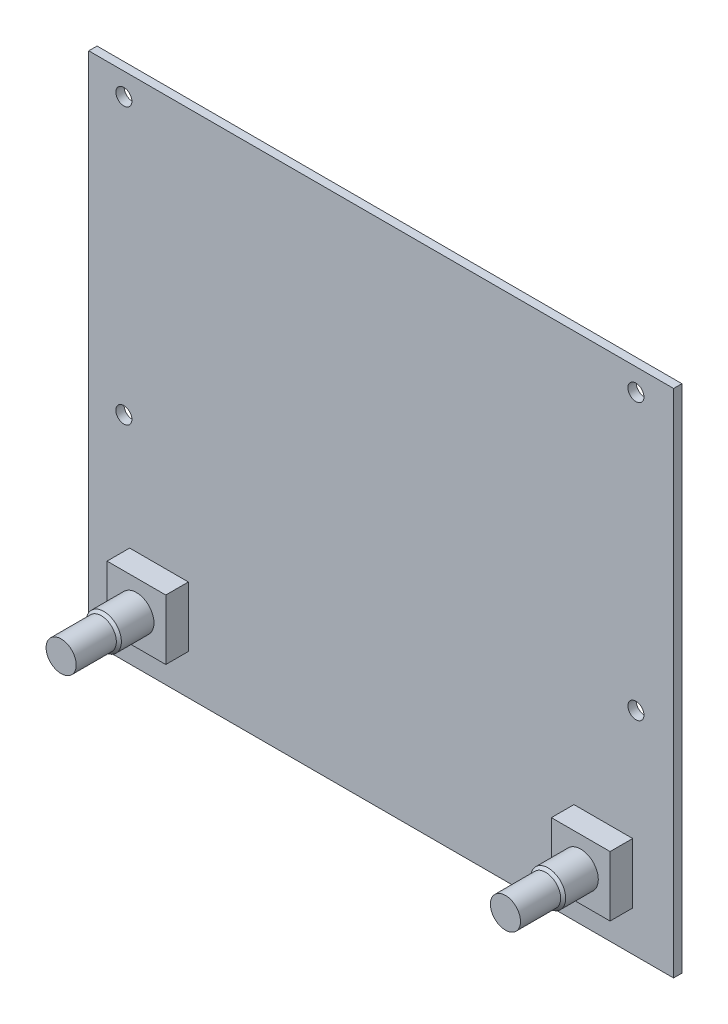
ISO-10303-21;
HEADER;
FILE_DESCRIPTION(('STEP AP214'),'2;1');
FILE_NAME('part.step','',(''),(''),'','','');
FILE_SCHEMA(('AUTOMOTIVE_DESIGN { 1 0 10303 214 1 1 1 1 }'));
ENDSEC;
DATA;
#1=APPLICATION_CONTEXT('core data for automotive mechanical design processes');
#2=APPLICATION_PROTOCOL_DEFINITION('international standard','automotive_design',2000,#1);
#3=PRODUCT_CONTEXT('',#1,'mechanical');
#4=PRODUCT('Part','Part','',(#3));
#5=PRODUCT_RELATED_PRODUCT_CATEGORY('part','',(#4));
#6=PRODUCT_DEFINITION_FORMATION('','',#4);
#7=PRODUCT_DEFINITION_CONTEXT('part definition',#1,'design');
#8=PRODUCT_DEFINITION('design','',#6,#7);
#9=PRODUCT_DEFINITION_SHAPE('','',#8);
#10=(LENGTH_UNIT() NAMED_UNIT(*) SI_UNIT(.MILLI.,.METRE.));
#11=(NAMED_UNIT(*) PLANE_ANGLE_UNIT() SI_UNIT($,.RADIAN.));
#12=(NAMED_UNIT(*) SI_UNIT($,.STERADIAN.) SOLID_ANGLE_UNIT());
#13=UNCERTAINTY_MEASURE_WITH_UNIT(LENGTH_MEASURE(1.E-05),#10,'distance_accuracy_value','');
#14=(GEOMETRIC_REPRESENTATION_CONTEXT(3) GLOBAL_UNCERTAINTY_ASSIGNED_CONTEXT((#13)) GLOBAL_UNIT_ASSIGNED_CONTEXT((#10,
#11,#12)) REPRESENTATION_CONTEXT('',''));
#15=CARTESIAN_POINT('',(0.,0.,0.));
#16=DIRECTION('',(0.,0.,1.));
#17=DIRECTION('',(1.,0.,0.));
#18=AXIS2_PLACEMENT_3D('',#15,#16,#17);
#19=CARTESIAN_POINT('',(0.,0.,1.65608));
#20=DIRECTION('',(0.,0.,1.));
#21=DIRECTION('',(1.,0.,0.));
#22=AXIS2_PLACEMENT_3D('',#19,#20,#21);
#23=PLANE('',#22);
#24=CARTESIAN_POINT('',(50.76952,-8.44931,1.65608));
#25=DIRECTION('',(0.,0.,1.));
#26=DIRECTION('',(1.,0.,0.));
#27=AXIS2_PLACEMENT_3D('',#24,#25,#26);
#28=CIRCLE('',#27,1.6002);
#29=CARTESIAN_POINT('',(52.36972,-8.44931,1.65608));
#30=VERTEX_POINT('',#29);
#31=EDGE_CURVE('E229',#30,#30,#28,.T.);
#32=ORIENTED_EDGE('',*,*,#31,.F.);
#33=EDGE_LOOP('',(#32));
#34=FACE_BOUND('',#33,.T.);
#35=CARTESIAN_POINT('',(-51.2699,46.45025,1.65608));
#36=DIRECTION('',(0.,0.,1.));
#37=DIRECTION('',(1.,0.,0.));
#38=AXIS2_PLACEMENT_3D('',#35,#36,#37);
#39=CIRCLE('',#38,1.6002);
#40=CARTESIAN_POINT('',(-49.6697,46.45025,1.65608));
#41=VERTEX_POINT('',#40);
#42=EDGE_CURVE('E241',#41,#41,#39,.T.);
#43=ORIENTED_EDGE('',*,*,#42,.F.);
#44=EDGE_LOOP('',(#43));
#45=FACE_BOUND('',#44,.T.);
#46=DIRECTION('',(0.,1.,0.));
#47=VECTOR('',#46,1.);
#48=CARTESIAN_POINT('',(58.27014,50.86985,1.65608));
#49=LINE('',#48,#47);
#50=CARTESIAN_POINT('',(58.27014,-50.86985,1.65608));
#51=VERTEX_POINT('',#50);
#52=CARTESIAN_POINT('',(58.27014,50.86985,1.65608));
#53=VERTEX_POINT('',#52);
#54=EDGE_CURVE('E247',#51,#53,#49,.T.);
#55=ORIENTED_EDGE('',*,*,#54,.T.);
#56=DIRECTION('',(-1.,0.,0.));
#57=VECTOR('',#56,1.);
#58=CARTESIAN_POINT('',(-58.27014,50.86985,1.65608));
#59=LINE('',#58,#57);
#60=CARTESIAN_POINT('',(-58.27014,50.86985,1.65608));
#61=VERTEX_POINT('',#60);
#62=EDGE_CURVE('E251',#53,#61,#59,.T.);
#63=ORIENTED_EDGE('',*,*,#62,.T.);
#64=DIRECTION('',(0.,-1.,0.));
#65=VECTOR('',#64,1.);
#66=CARTESIAN_POINT('',(-58.27014,50.86985,1.65608));
#67=LINE('',#66,#65);
#68=CARTESIAN_POINT('',(-58.27014,-50.86985,1.65608));
#69=VERTEX_POINT('',#68);
#70=EDGE_CURVE('E254',#61,#69,#67,.T.);
#71=ORIENTED_EDGE('',*,*,#70,.T.);
#72=DIRECTION('',(1.,0.,0.));
#73=VECTOR('',#72,1.);
#74=CARTESIAN_POINT('',(-58.27014,-50.86985,1.65608));
#75=LINE('',#74,#73);
#76=EDGE_CURVE('E257',#69,#51,#75,.T.);
#77=ORIENTED_EDGE('',*,*,#76,.T.);
#78=EDGE_LOOP('',(#55,#63,#71,#77));
#79=FACE_BOUND('',#78,.T.);
#80=CARTESIAN_POINT('',(50.76952,46.45025,1.65608));
#81=DIRECTION('',(0.,0.,1.));
#82=DIRECTION('',(1.,0.,0.));
#83=AXIS2_PLACEMENT_3D('',#80,#81,#82);
#84=CIRCLE('',#83,1.6002);
#85=CARTESIAN_POINT('',(52.36972,46.45025,1.65608));
#86=VERTEX_POINT('',#85);
#87=EDGE_CURVE('E235',#86,#86,#84,.T.);
#88=ORIENTED_EDGE('',*,*,#87,.F.);
#89=EDGE_LOOP('',(#88));
#90=FACE_BOUND('',#89,.T.);
#91=CARTESIAN_POINT('',(-51.2699,-8.44931,1.65608));
#92=DIRECTION('',(0.,0.,1.));
#93=DIRECTION('',(1.,0.,0.));
#94=AXIS2_PLACEMENT_3D('',#91,#92,#93);
#95=CIRCLE('',#94,1.6002);
#96=CARTESIAN_POINT('',(-49.6697,-8.44931,1.65608));
#97=VERTEX_POINT('',#96);
#98=EDGE_CURVE('E184',#97,#97,#95,.T.);
#99=ORIENTED_EDGE('',*,*,#98,.F.);
#100=EDGE_LOOP('',(#99));
#101=FACE_BOUND('',#100,.T.);
#102=DIRECTION('',(-1.,0.,0.));
#103=VECTOR('',#102,1.);
#104=CARTESIAN_POINT('',(50.11928,-30.8698899999999,1.65608));
#105=LINE('',#104,#103);
#106=CARTESIAN_POINT('',(50.11928,-30.8698899999999,1.65608));
#107=VERTEX_POINT('',#106);
#108=CARTESIAN_POINT('',(38.42004,-30.8698899999999,1.65608));
#109=VERTEX_POINT('',#108);
#110=EDGE_CURVE('E210',#107,#109,#105,.T.);
#111=ORIENTED_EDGE('',*,*,#110,.F.);
#112=DIRECTION('',(0.,1.,0.));
#113=VECTOR('',#112,1.);
#114=CARTESIAN_POINT('',(50.11928,-42.8688499999999,1.65608));
#115=LINE('',#114,#113);
#116=CARTESIAN_POINT('',(50.11928,-42.8688499999999,1.65608));
#117=VERTEX_POINT('',#116);
#118=EDGE_CURVE('E212',#117,#107,#115,.T.);
#119=ORIENTED_EDGE('',*,*,#118,.F.);
#120=DIRECTION('',(1.,0.,0.));
#121=VECTOR('',#120,1.);
#122=CARTESIAN_POINT('',(50.11928,-42.8688499999999,1.65608));
#123=LINE('',#122,#121);
#124=CARTESIAN_POINT('',(38.42004,-42.8688499999999,1.65608));
#125=VERTEX_POINT('',#124);
#126=EDGE_CURVE('E203',#125,#117,#123,.T.);
#127=ORIENTED_EDGE('',*,*,#126,.F.);
#128=DIRECTION('',(0.,-1.,0.));
#129=VECTOR('',#128,1.);
#130=CARTESIAN_POINT('',(38.42004,-42.8688499999999,1.65608));
#131=LINE('',#130,#129);
#132=EDGE_CURVE('E206',#109,#125,#131,.T.);
#133=ORIENTED_EDGE('',*,*,#132,.F.);
#134=EDGE_LOOP('',(#111,#119,#127,#133));
#135=FACE_BOUND('',#134,.T.);
#136=DIRECTION('',(1.,0.,0.));
#137=VECTOR('',#136,1.);
#138=CARTESIAN_POINT('',(-50.11928,-42.86885,1.65608));
#139=LINE('',#138,#137);
#140=CARTESIAN_POINT('',(-50.11928,-42.86885,1.65608));
#141=VERTEX_POINT('',#140);
#142=CARTESIAN_POINT('',(-38.42004,-42.86885,1.65608));
#143=VERTEX_POINT('',#142);
#144=EDGE_CURVE('E371',#141,#143,#139,.T.);
#145=ORIENTED_EDGE('',*,*,#144,.F.);
#146=DIRECTION('',(0.,-1.,0.));
#147=VECTOR('',#146,1.);
#148=CARTESIAN_POINT('',(-50.11928,-42.86885,1.65608));
#149=LINE('',#148,#147);
#150=CARTESIAN_POINT('',(-50.11928,-30.86989,1.65608));
#151=VERTEX_POINT('',#150);
#152=EDGE_CURVE('E177',#151,#141,#149,.T.);
#153=ORIENTED_EDGE('',*,*,#152,.F.);
#154=DIRECTION('',(-1.,0.,0.));
#155=VECTOR('',#154,1.);
#156=CARTESIAN_POINT('',(-50.11928,-30.86989,1.65608));
#157=LINE('',#156,#155);
#158=CARTESIAN_POINT('',(-38.42004,-30.86989,1.65608));
#159=VERTEX_POINT('',#158);
#160=EDGE_CURVE('E173',#159,#151,#157,.T.);
#161=ORIENTED_EDGE('',*,*,#160,.F.);
#162=DIRECTION('',(0.,1.,0.));
#163=VECTOR('',#162,1.);
#164=CARTESIAN_POINT('',(-38.42004,-42.86885,1.65608));
#165=LINE('',#164,#163);
#166=EDGE_CURVE('E373',#143,#159,#165,.T.);
#167=ORIENTED_EDGE('',*,*,#166,.F.);
#168=EDGE_LOOP('',(#145,#153,#161,#167));
#169=FACE_BOUND('',#168,.T.);
#170=ADVANCED_FACE('F51',(#34,#45,#79,#90,#101,#135,#169),#23,.T.);
#171=CARTESIAN_POINT('',(0.,0.,0.));
#172=DIRECTION('',(0.,0.,1.));
#173=DIRECTION('',(1.,0.,0.));
#174=AXIS2_PLACEMENT_3D('',#171,#172,#173);
#175=PLANE('',#174);
#176=DIRECTION('',(0.,1.,0.));
#177=VECTOR('',#176,1.);
#178=CARTESIAN_POINT('',(58.27014,50.86985,0.));
#179=LINE('',#178,#177);
#180=CARTESIAN_POINT('',(58.27014,-50.86985,0.));
#181=VERTEX_POINT('',#180);
#182=CARTESIAN_POINT('',(58.27014,50.86985,0.));
#183=VERTEX_POINT('',#182);
#184=EDGE_CURVE('E244',#181,#183,#179,.T.);
#185=ORIENTED_EDGE('',*,*,#184,.F.);
#186=DIRECTION('',(1.,0.,0.));
#187=VECTOR('',#186,1.);
#188=CARTESIAN_POINT('',(-58.27014,-50.86985,0.));
#189=LINE('',#188,#187);
#190=CARTESIAN_POINT('',(-58.27014,-50.86985,0.));
#191=VERTEX_POINT('',#190);
#192=EDGE_CURVE('E252',#191,#181,#189,.T.);
#193=ORIENTED_EDGE('',*,*,#192,.F.);
#194=DIRECTION('',(0.,-1.,0.));
#195=VECTOR('',#194,1.);
#196=CARTESIAN_POINT('',(-58.27014,50.86985,0.));
#197=LINE('',#196,#195);
#198=CARTESIAN_POINT('',(-58.27014,50.86985,0.));
#199=VERTEX_POINT('',#198);
#200=EDGE_CURVE('E266',#199,#191,#197,.T.);
#201=ORIENTED_EDGE('',*,*,#200,.F.);
#202=DIRECTION('',(-1.,0.,0.));
#203=VECTOR('',#202,1.);
#204=CARTESIAN_POINT('',(-58.27014,50.86985,0.));
#205=LINE('',#204,#203);
#206=EDGE_CURVE('E264',#183,#199,#205,.T.);
#207=ORIENTED_EDGE('',*,*,#206,.F.);
#208=EDGE_LOOP('',(#185,#193,#201,#207));
#209=FACE_BOUND('',#208,.T.);
#210=CARTESIAN_POINT('',(-51.2699,46.45025,0.));
#211=DIRECTION('',(0.,0.,1.));
#212=DIRECTION('',(1.,0.,0.));
#213=AXIS2_PLACEMENT_3D('',#210,#211,#212);
#214=CIRCLE('',#213,1.6002);
#215=CARTESIAN_POINT('',(-49.6697,46.45025,0.));
#216=VERTEX_POINT('',#215);
#217=EDGE_CURVE('E238',#216,#216,#214,.T.);
#218=ORIENTED_EDGE('',*,*,#217,.T.);
#219=EDGE_LOOP('',(#218));
#220=FACE_BOUND('',#219,.T.);
#221=CARTESIAN_POINT('',(50.76952,46.45025,0.));
#222=DIRECTION('',(0.,0.,1.));
#223=DIRECTION('',(1.,0.,0.));
#224=AXIS2_PLACEMENT_3D('',#221,#222,#223);
#225=CIRCLE('',#224,1.6002);
#226=CARTESIAN_POINT('',(52.36972,46.45025,0.));
#227=VERTEX_POINT('',#226);
#228=EDGE_CURVE('E232',#227,#227,#225,.T.);
#229=ORIENTED_EDGE('',*,*,#228,.T.);
#230=EDGE_LOOP('',(#229));
#231=FACE_BOUND('',#230,.T.);
#232=CARTESIAN_POINT('',(50.76952,-8.44931,0.));
#233=DIRECTION('',(0.,0.,1.));
#234=DIRECTION('',(1.,0.,0.));
#235=AXIS2_PLACEMENT_3D('',#232,#233,#234);
#236=CIRCLE('',#235,1.6002);
#237=CARTESIAN_POINT('',(52.36972,-8.44931,0.));
#238=VERTEX_POINT('',#237);
#239=EDGE_CURVE('E227',#238,#238,#236,.T.);
#240=ORIENTED_EDGE('',*,*,#239,.T.);
#241=EDGE_LOOP('',(#240));
#242=FACE_BOUND('',#241,.T.);
#243=CARTESIAN_POINT('',(-51.2699,-8.44931,0.));
#244=DIRECTION('',(0.,0.,1.));
#245=DIRECTION('',(1.,0.,0.));
#246=AXIS2_PLACEMENT_3D('',#243,#244,#245);
#247=CIRCLE('',#246,1.6002);
#248=CARTESIAN_POINT('',(-49.6697,-8.44931,0.));
#249=VERTEX_POINT('',#248);
#250=EDGE_CURVE('E180',#249,#249,#247,.T.);
#251=ORIENTED_EDGE('',*,*,#250,.T.);
#252=EDGE_LOOP('',(#251));
#253=FACE_BOUND('',#252,.T.);
#254=ADVANCED_FACE('F312',(#209,#220,#231,#242,#253),#175,.F.);
#255=CARTESIAN_POINT('',(58.27014,50.86985,1.65608));
#256=DIRECTION('',(-1.,0.,0.));
#257=DIRECTION('',(0.,-1.,0.));
#258=AXIS2_PLACEMENT_3D('',#255,#256,#257);
#259=PLANE('',#258);
#260=ORIENTED_EDGE('',*,*,#184,.T.);
#261=DIRECTION('',(0.,0.,-1.));
#262=VECTOR('',#261,1.);
#263=CARTESIAN_POINT('',(58.27014,50.86985,1.65608));
#264=LINE('',#263,#262);
#265=EDGE_CURVE('E279',#53,#183,#264,.T.);
#266=ORIENTED_EDGE('',*,*,#265,.F.);
#267=ORIENTED_EDGE('',*,*,#54,.F.);
#268=DIRECTION('',(0.,0.,-1.));
#269=VECTOR('',#268,1.);
#270=CARTESIAN_POINT('',(58.27014,-50.86985,1.65608));
#271=LINE('',#270,#269);
#272=EDGE_CURVE('E260',#51,#181,#271,.T.);
#273=ORIENTED_EDGE('',*,*,#272,.T.);
#274=EDGE_LOOP('',(#260,#266,#267,#273));
#275=FACE_BOUND('',#274,.T.);
#276=ADVANCED_FACE('F318',(#275),#259,.F.);
#277=CARTESIAN_POINT('',(-58.27014,50.86985,1.65608));
#278=DIRECTION('',(0.,-1.,0.));
#279=DIRECTION('',(0.,0.,-1.));
#280=AXIS2_PLACEMENT_3D('',#277,#278,#279);
#281=PLANE('',#280);
#282=ORIENTED_EDGE('',*,*,#206,.T.);
#283=DIRECTION('',(0.,0.,-1.));
#284=VECTOR('',#283,1.);
#285=CARTESIAN_POINT('',(-58.27014,50.86985,1.65608));
#286=LINE('',#285,#284);
#287=EDGE_CURVE('E276',#61,#199,#286,.T.);
#288=ORIENTED_EDGE('',*,*,#287,.F.);
#289=ORIENTED_EDGE('',*,*,#62,.F.);
#290=ORIENTED_EDGE('',*,*,#265,.T.);
#291=EDGE_LOOP('',(#282,#288,#289,#290));
#292=FACE_BOUND('',#291,.T.);
#293=ADVANCED_FACE('F334',(#292),#281,.F.);
#294=CARTESIAN_POINT('',(-58.27014,50.86985,1.65608));
#295=DIRECTION('',(1.,0.,0.));
#296=DIRECTION('',(0.,1.,0.));
#297=AXIS2_PLACEMENT_3D('',#294,#295,#296);
#298=PLANE('',#297);
#299=ORIENTED_EDGE('',*,*,#200,.T.);
#300=DIRECTION('',(0.,0.,-1.));
#301=VECTOR('',#300,1.);
#302=CARTESIAN_POINT('',(-58.27014,-50.86985,1.65608));
#303=LINE('',#302,#301);
#304=EDGE_CURVE('E273',#69,#191,#303,.T.);
#305=ORIENTED_EDGE('',*,*,#304,.F.);
#306=ORIENTED_EDGE('',*,*,#70,.F.);
#307=ORIENTED_EDGE('',*,*,#287,.T.);
#308=EDGE_LOOP('',(#299,#305,#306,#307));
#309=FACE_BOUND('',#308,.T.);
#310=ADVANCED_FACE('F330',(#309),#298,.F.);
#311=CARTESIAN_POINT('',(-58.27014,-50.86985,1.65608));
#312=DIRECTION('',(0.,1.,0.));
#313=DIRECTION('',(0.,0.,1.));
#314=AXIS2_PLACEMENT_3D('',#311,#312,#313);
#315=PLANE('',#314);
#316=ORIENTED_EDGE('',*,*,#192,.T.);
#317=ORIENTED_EDGE('',*,*,#272,.F.);
#318=ORIENTED_EDGE('',*,*,#76,.F.);
#319=ORIENTED_EDGE('',*,*,#304,.T.);
#320=EDGE_LOOP('',(#316,#317,#318,#319));
#321=FACE_BOUND('',#320,.T.);
#322=ADVANCED_FACE('F327',(#321),#315,.F.);
#323=CARTESIAN_POINT('',(-51.2699,46.45025,1.65608));
#324=DIRECTION('',(0.,0.,-1.));
#325=DIRECTION('',(-1.,0.,0.));
#326=AXIS2_PLACEMENT_3D('',#323,#324,#325);
#327=CYLINDRICAL_SURFACE('',#326,1.6002);
#328=ORIENTED_EDGE('',*,*,#42,.T.);
#329=EDGE_LOOP('',(#328));
#330=FACE_BOUND('',#329,.T.);
#331=ORIENTED_EDGE('',*,*,#217,.F.);
#332=EDGE_LOOP('',(#331));
#333=FACE_BOUND('',#332,.T.);
#334=ADVANCED_FACE('F324',(#330,#333),#327,.F.);
#335=CARTESIAN_POINT('',(50.76952,46.45025,1.65608));
#336=DIRECTION('',(0.,0.,-1.));
#337=DIRECTION('',(-1.,0.,0.));
#338=AXIS2_PLACEMENT_3D('',#335,#336,#337);
#339=CYLINDRICAL_SURFACE('',#338,1.6002);
#340=ORIENTED_EDGE('',*,*,#87,.T.);
#341=EDGE_LOOP('',(#340));
#342=FACE_BOUND('',#341,.T.);
#343=ORIENTED_EDGE('',*,*,#228,.F.);
#344=EDGE_LOOP('',(#343));
#345=FACE_BOUND('',#344,.T.);
#346=ADVANCED_FACE('F461',(#342,#345),#339,.F.);
#347=CARTESIAN_POINT('',(50.76952,-8.44931,1.65608));
#348=DIRECTION('',(0.,0.,-1.));
#349=DIRECTION('',(-1.,0.,0.));
#350=AXIS2_PLACEMENT_3D('',#347,#348,#349);
#351=CYLINDRICAL_SURFACE('',#350,1.6002);
#352=ORIENTED_EDGE('',*,*,#31,.T.);
#353=EDGE_LOOP('',(#352));
#354=FACE_BOUND('',#353,.T.);
#355=ORIENTED_EDGE('',*,*,#239,.F.);
#356=EDGE_LOOP('',(#355));
#357=FACE_BOUND('',#356,.T.);
#358=ADVANCED_FACE('F458',(#354,#357),#351,.F.);
#359=CARTESIAN_POINT('',(-51.2699,-8.44931,1.65608));
#360=DIRECTION('',(0.,0.,-1.));
#361=DIRECTION('',(-1.,0.,0.));
#362=AXIS2_PLACEMENT_3D('',#359,#360,#361);
#363=CYLINDRICAL_SURFACE('',#362,1.6002);
#364=ORIENTED_EDGE('',*,*,#98,.T.);
#365=EDGE_LOOP('',(#364));
#366=FACE_BOUND('',#365,.T.);
#367=ORIENTED_EDGE('',*,*,#250,.F.);
#368=EDGE_LOOP('',(#367));
#369=FACE_BOUND('',#368,.T.);
#370=ADVANCED_FACE('F441',(#366,#369),#363,.F.);
#371=CARTESIAN_POINT('',(50.11928,-42.8688499999999,6.15608));
#372=DIRECTION('',(-1.,0.,0.));
#373=DIRECTION('',(0.,-1.,0.));
#374=AXIS2_PLACEMENT_3D('',#371,#372,#373);
#375=PLANE('',#374);
#376=ORIENTED_EDGE('',*,*,#118,.T.);
#377=DIRECTION('',(0.,0.,-1.));
#378=VECTOR('',#377,1.);
#379=CARTESIAN_POINT('',(50.11928,-30.8698899999999,6.15608));
#380=LINE('',#379,#378);
#381=CARTESIAN_POINT('',(50.11928,-30.8698899999999,6.15608));
#382=VERTEX_POINT('',#381);
#383=EDGE_CURVE('E190',#382,#107,#380,.T.);
#384=ORIENTED_EDGE('',*,*,#383,.F.);
#385=DIRECTION('',(0.,1.,0.));
#386=VECTOR('',#385,1.);
#387=CARTESIAN_POINT('',(50.11928,-42.8688499999999,6.15608));
#388=LINE('',#387,#386);
#389=CARTESIAN_POINT('',(50.11928,-42.8688499999999,6.15608));
#390=VERTEX_POINT('',#389);
#391=EDGE_CURVE('E207',#390,#382,#388,.T.);
#392=ORIENTED_EDGE('',*,*,#391,.F.);
#393=DIRECTION('',(0.,0.,-1.));
#394=VECTOR('',#393,1.);
#395=CARTESIAN_POINT('',(50.11928,-42.8688499999999,6.15608));
#396=LINE('',#395,#394);
#397=EDGE_CURVE('E198',#390,#117,#396,.T.);
#398=ORIENTED_EDGE('',*,*,#397,.T.);
#399=EDGE_LOOP('',(#376,#384,#392,#398));
#400=FACE_BOUND('',#399,.T.);
#401=ADVANCED_FACE('F437',(#400),#375,.F.);
#402=CARTESIAN_POINT('',(50.11928,-30.8698899999999,6.15608));
#403=DIRECTION('',(0.,-1.,0.));
#404=DIRECTION('',(0.,0.,-1.));
#405=AXIS2_PLACEMENT_3D('',#402,#403,#404);
#406=PLANE('',#405);
#407=ORIENTED_EDGE('',*,*,#110,.T.);
#408=DIRECTION('',(0.,0.,-1.));
#409=VECTOR('',#408,1.);
#410=CARTESIAN_POINT('',(38.42004,-30.8698899999999,6.15608));
#411=LINE('',#410,#409);
#412=CARTESIAN_POINT('',(38.42004,-30.8698899999999,6.15608));
#413=VERTEX_POINT('',#412);
#414=EDGE_CURVE('E192',#413,#109,#411,.T.);
#415=ORIENTED_EDGE('',*,*,#414,.F.);
#416=DIRECTION('',(-1.,0.,0.));
#417=VECTOR('',#416,1.);
#418=CARTESIAN_POINT('',(50.11928,-30.8698899999999,6.15608));
#419=LINE('',#418,#417);
#420=EDGE_CURVE('E221',#382,#413,#419,.T.);
#421=ORIENTED_EDGE('',*,*,#420,.F.);
#422=ORIENTED_EDGE('',*,*,#383,.T.);
#423=EDGE_LOOP('',(#407,#415,#421,#422));
#424=FACE_BOUND('',#423,.T.);
#425=ADVANCED_FACE('F440',(#424),#406,.F.);
#426=CARTESIAN_POINT('',(38.42004,-42.8688499999999,6.15608));
#427=DIRECTION('',(1.,0.,0.));
#428=DIRECTION('',(0.,1.,0.));
#429=AXIS2_PLACEMENT_3D('',#426,#427,#428);
#430=PLANE('',#429);
#431=ORIENTED_EDGE('',*,*,#132,.T.);
#432=DIRECTION('',(0.,0.,-1.));
#433=VECTOR('',#432,1.);
#434=CARTESIAN_POINT('',(38.42004,-42.8688499999999,6.15608));
#435=LINE('',#434,#433);
#436=CARTESIAN_POINT('',(38.42004,-42.8688499999999,6.15608));
#437=VERTEX_POINT('',#436);
#438=EDGE_CURVE('E79',#437,#125,#435,.T.);
#439=ORIENTED_EDGE('',*,*,#438,.F.);
#440=DIRECTION('',(0.,-1.,0.));
#441=VECTOR('',#440,1.);
#442=CARTESIAN_POINT('',(38.42004,-42.8688499999999,6.15608));
#443=LINE('',#442,#441);
#444=EDGE_CURVE('E218',#413,#437,#443,.T.);
#445=ORIENTED_EDGE('',*,*,#444,.F.);
#446=ORIENTED_EDGE('',*,*,#414,.T.);
#447=EDGE_LOOP('',(#431,#439,#445,#446));
#448=FACE_BOUND('',#447,.T.);
#449=ADVANCED_FACE('F445',(#448),#430,.F.);
#450=CARTESIAN_POINT('',(50.11928,-42.8688499999999,6.15608));
#451=DIRECTION('',(0.,1.,0.));
#452=DIRECTION('',(0.,0.,1.));
#453=AXIS2_PLACEMENT_3D('',#450,#451,#452);
#454=PLANE('',#453);
#455=ORIENTED_EDGE('',*,*,#126,.T.);
#456=ORIENTED_EDGE('',*,*,#397,.F.);
#457=DIRECTION('',(1.,0.,0.));
#458=VECTOR('',#457,1.);
#459=CARTESIAN_POINT('',(50.11928,-42.8688499999999,6.15608));
#460=LINE('',#459,#458);
#461=EDGE_CURVE('E202',#437,#390,#460,.T.);
#462=ORIENTED_EDGE('',*,*,#461,.F.);
#463=ORIENTED_EDGE('',*,*,#438,.T.);
#464=EDGE_LOOP('',(#455,#456,#462,#463));
#465=FACE_BOUND('',#464,.T.);
#466=ADVANCED_FACE('F449',(#465),#454,.F.);
#467=CARTESIAN_POINT('',(0.,0.,6.15608));
#468=DIRECTION('',(0.,0.,1.));
#469=DIRECTION('',(1.,0.,0.));
#470=AXIS2_PLACEMENT_3D('',#467,#468,#469);
#471=PLANE('',#470);
#472=CARTESIAN_POINT('',(44.26966,-36.8693699999999,6.15608));
#473=DIRECTION('',(0.,0.,1.));
#474=DIRECTION('',(1.,0.,0.));
#475=AXIS2_PLACEMENT_3D('',#472,#473,#474);
#476=CIRCLE('',#475,3.5);
#477=CARTESIAN_POINT('',(47.76966,-36.8693699999999,6.15608));
#478=VERTEX_POINT('',#477);
#479=EDGE_CURVE('E287',#478,#478,#476,.T.);
#480=ORIENTED_EDGE('',*,*,#479,.F.);
#481=EDGE_LOOP('',(#480));
#482=FACE_BOUND('',#481,.T.);
#483=ORIENTED_EDGE('',*,*,#391,.T.);
#484=ORIENTED_EDGE('',*,*,#420,.T.);
#485=ORIENTED_EDGE('',*,*,#444,.T.);
#486=ORIENTED_EDGE('',*,*,#461,.T.);
#487=EDGE_LOOP('',(#483,#484,#485,#486));
#488=FACE_BOUND('',#487,.T.);
#489=ADVANCED_FACE('F436',(#482,#488),#471,.T.);
#490=CARTESIAN_POINT('',(-50.11928,-42.86885,6.15608));
#491=DIRECTION('',(1.,0.,0.));
#492=DIRECTION('',(0.,0.,-1.));
#493=AXIS2_PLACEMENT_3D('',#490,#491,#492);
#494=PLANE('',#493);
#495=ORIENTED_EDGE('',*,*,#152,.T.);
#496=DIRECTION('',(0.,0.,-1.));
#497=VECTOR('',#496,1.);
#498=CARTESIAN_POINT('',(-50.11928,-42.86885,6.15608));
#499=LINE('',#498,#497);
#500=CARTESIAN_POINT('',(-50.11928,-42.86885,6.15608));
#501=VERTEX_POINT('',#500);
#502=EDGE_CURVE('E156',#501,#141,#499,.T.);
#503=ORIENTED_EDGE('',*,*,#502,.F.);
#504=DIRECTION('',(0.,-1.,0.));
#505=VECTOR('',#504,1.);
#506=CARTESIAN_POINT('',(-50.11928,-42.86885,6.15608));
#507=LINE('',#506,#505);
#508=CARTESIAN_POINT('',(-50.11928,-30.86989,6.15608));
#509=VERTEX_POINT('',#508);
#510=EDGE_CURVE('E164',#509,#501,#507,.T.);
#511=ORIENTED_EDGE('',*,*,#510,.F.);
#512=DIRECTION('',(0.,0.,-1.));
#513=VECTOR('',#512,1.);
#514=CARTESIAN_POINT('',(-50.11928,-30.86989,6.15608));
#515=LINE('',#514,#513);
#516=EDGE_CURVE('E383',#509,#151,#515,.T.);
#517=ORIENTED_EDGE('',*,*,#516,.T.);
#518=EDGE_LOOP('',(#495,#503,#511,#517));
#519=FACE_BOUND('',#518,.T.);
#520=ADVANCED_FACE('F175',(#519),#494,.F.);
#521=CARTESIAN_POINT('',(-50.11928,-42.86885,6.15608));
#522=DIRECTION('',(0.,1.,0.));
#523=DIRECTION('',(0.,0.,1.));
#524=AXIS2_PLACEMENT_3D('',#521,#522,#523);
#525=PLANE('',#524);
#526=ORIENTED_EDGE('',*,*,#144,.T.);
#527=DIRECTION('',(0.,0.,-1.));
#528=VECTOR('',#527,1.);
#529=CARTESIAN_POINT('',(-38.42004,-42.86885,6.15608));
#530=LINE('',#529,#528);
#531=CARTESIAN_POINT('',(-38.42004,-42.86885,6.15608));
#532=VERTEX_POINT('',#531);
#533=EDGE_CURVE('E159',#532,#143,#530,.T.);
#534=ORIENTED_EDGE('',*,*,#533,.F.);
#535=DIRECTION('',(1.,0.,0.));
#536=VECTOR('',#535,1.);
#537=CARTESIAN_POINT('',(-50.11928,-42.86885,6.15608));
#538=LINE('',#537,#536);
#539=EDGE_CURVE('E152',#501,#532,#538,.T.);
#540=ORIENTED_EDGE('',*,*,#539,.F.);
#541=ORIENTED_EDGE('',*,*,#502,.T.);
#542=EDGE_LOOP('',(#526,#534,#540,#541));
#543=FACE_BOUND('',#542,.T.);
#544=ADVANCED_FACE('F154',(#543),#525,.F.);
#545=CARTESIAN_POINT('',(-38.42004,-42.86885,6.15608));
#546=DIRECTION('',(-1.,0.,0.));
#547=DIRECTION('',(0.,0.,1.));
#548=AXIS2_PLACEMENT_3D('',#545,#546,#547);
#549=PLANE('',#548);
#550=ORIENTED_EDGE('',*,*,#166,.T.);
#551=DIRECTION('',(0.,0.,-1.));
#552=VECTOR('',#551,1.);
#553=CARTESIAN_POINT('',(-38.42004,-30.86989,6.15608));
#554=LINE('',#553,#552);
#555=CARTESIAN_POINT('',(-38.42004,-30.86989,6.15608));
#556=VERTEX_POINT('',#555);
#557=EDGE_CURVE('E68',#556,#159,#554,.T.);
#558=ORIENTED_EDGE('',*,*,#557,.F.);
#559=DIRECTION('',(0.,1.,0.));
#560=VECTOR('',#559,1.);
#561=CARTESIAN_POINT('',(-38.42004,-42.86885,6.15608));
#562=LINE('',#561,#560);
#563=EDGE_CURVE('E163',#532,#556,#562,.T.);
#564=ORIENTED_EDGE('',*,*,#563,.F.);
#565=ORIENTED_EDGE('',*,*,#533,.T.);
#566=EDGE_LOOP('',(#550,#558,#564,#565));
#567=FACE_BOUND('',#566,.T.);
#568=ADVANCED_FACE('F428',(#567),#549,.F.);
#569=CARTESIAN_POINT('',(-50.11928,-30.86989,6.15608));
#570=DIRECTION('',(0.,-1.,0.));
#571=DIRECTION('',(0.,0.,-1.));
#572=AXIS2_PLACEMENT_3D('',#569,#570,#571);
#573=PLANE('',#572);
#574=ORIENTED_EDGE('',*,*,#160,.T.);
#575=ORIENTED_EDGE('',*,*,#516,.F.);
#576=DIRECTION('',(-1.,0.,0.));
#577=VECTOR('',#576,1.);
#578=CARTESIAN_POINT('',(-50.11928,-30.86989,6.15608));
#579=LINE('',#578,#577);
#580=EDGE_CURVE('E168',#556,#509,#579,.T.);
#581=ORIENTED_EDGE('',*,*,#580,.F.);
#582=ORIENTED_EDGE('',*,*,#557,.T.);
#583=EDGE_LOOP('',(#574,#575,#581,#582));
#584=FACE_BOUND('',#583,.T.);
#585=ADVANCED_FACE('F424',(#584),#573,.F.);
#586=CARTESIAN_POINT('',(0.,0.,6.15608));
#587=DIRECTION('',(0.,0.,-1.));
#588=DIRECTION('',(-1.,0.,0.));
#589=AXIS2_PLACEMENT_3D('',#586,#587,#588);
#590=PLANE('',#589);
#591=CARTESIAN_POINT('',(-44.26966,-36.86937,6.15608));
#592=DIRECTION('',(0.,0.,1.));
#593=DIRECTION('',(1.,0.,0.));
#594=AXIS2_PLACEMENT_3D('',#591,#592,#593);
#595=CIRCLE('',#594,3.5);
#596=CARTESIAN_POINT('',(-40.76966,-36.86937,6.15608));
#597=VERTEX_POINT('',#596);
#598=EDGE_CURVE('E282',#597,#597,#595,.T.);
#599=ORIENTED_EDGE('',*,*,#598,.F.);
#600=EDGE_LOOP('',(#599));
#601=FACE_BOUND('',#600,.T.);
#602=ORIENTED_EDGE('',*,*,#510,.T.);
#603=ORIENTED_EDGE('',*,*,#539,.T.);
#604=ORIENTED_EDGE('',*,*,#563,.T.);
#605=ORIENTED_EDGE('',*,*,#580,.T.);
#606=EDGE_LOOP('',(#602,#603,#604,#605));
#607=FACE_BOUND('',#606,.T.);
#608=ADVANCED_FACE('F167',(#601,#607),#590,.F.);
#609=CARTESIAN_POINT('',(-44.26966,-36.86937,13.15608));
#610=DIRECTION('',(0.,0.,-1.));
#611=DIRECTION('',(-1.,0.,0.));
#612=AXIS2_PLACEMENT_3D('',#609,#610,#611);
#613=CYLINDRICAL_SURFACE('',#612,3.5);
#614=CARTESIAN_POINT('',(-44.26966,-36.86937,12.65608));
#615=DIRECTION('',(0.,0.,1.));
#616=DIRECTION('',(1.,0.,0.));
#617=AXIS2_PLACEMENT_3D('',#614,#615,#616);
#618=CIRCLE('',#617,3.5);
#619=CARTESIAN_POINT('',(-40.76966,-36.86937,12.65608));
#620=VERTEX_POINT('',#619);
#621=EDGE_CURVE('E11',#620,#620,#618,.F.);
#622=ORIENTED_EDGE('',*,*,#621,.T.);
#623=EDGE_LOOP('',(#622));
#624=FACE_BOUND('',#623,.T.);
#625=ORIENTED_EDGE('',*,*,#598,.T.);
#626=EDGE_LOOP('',(#625));
#627=FACE_BOUND('',#626,.T.);
#628=ADVANCED_FACE('F416',(#624,#627),#613,.T.);
#629=CARTESIAN_POINT('',(44.26966,-36.8693699999999,13.15608));
#630=DIRECTION('',(0.,0.,-1.));
#631=DIRECTION('',(-1.,0.,0.));
#632=AXIS2_PLACEMENT_3D('',#629,#630,#631);
#633=CYLINDRICAL_SURFACE('',#632,3.5);
#634=CARTESIAN_POINT('',(44.26966,-36.8693699999999,12.65608));
#635=DIRECTION('',(0.,0.,1.));
#636=DIRECTION('',(1.,0.,0.));
#637=AXIS2_PLACEMENT_3D('',#634,#635,#636);
#638=CIRCLE('',#637,3.5);
#639=CARTESIAN_POINT('',(47.76966,-36.8693699999999,12.65608));
#640=VERTEX_POINT('',#639);
#641=EDGE_CURVE('E286',#640,#640,#638,.F.);
#642=ORIENTED_EDGE('',*,*,#641,.T.);
#643=EDGE_LOOP('',(#642));
#644=FACE_BOUND('',#643,.T.);
#645=ORIENTED_EDGE('',*,*,#479,.T.);
#646=EDGE_LOOP('',(#645));
#647=FACE_BOUND('',#646,.T.);
#648=ADVANCED_FACE('F308',(#644,#647),#633,.T.);
#649=CARTESIAN_POINT('',(44.26966,-36.8693699999999,13.15608));
#650=DIRECTION('',(0.,0.,-1.));
#651=DIRECTION('',(-1.,0.,0.));
#652=AXIS2_PLACEMENT_3D('',#649,#650,#651);
#653=CONICAL_SURFACE('',#652,3.00000000000002,0.785398163397446);
#654=ORIENTED_EDGE('',*,*,#641,.F.);
#655=EDGE_LOOP('',(#654));
#656=FACE_BOUND('',#655,.T.);
#657=CARTESIAN_POINT('',(44.26966,-36.8693699999999,13.15608));
#658=DIRECTION('',(0.,0.,1.));
#659=DIRECTION('',(1.,0.,0.));
#660=AXIS2_PLACEMENT_3D('',#657,#658,#659);
#661=CIRCLE('',#660,3.00000000000002);
#662=CARTESIAN_POINT('',(47.26966,-36.8693699999999,13.15608));
#663=VERTEX_POINT('',#662);
#664=EDGE_CURVE('E283',#663,#663,#661,.T.);
#665=ORIENTED_EDGE('',*,*,#664,.F.);
#666=EDGE_LOOP('',(#665));
#667=FACE_BOUND('',#666,.T.);
#668=ADVANCED_FACE('F298',(#656,#667),#653,.T.);
#669=CARTESIAN_POINT('',(-44.26966,-36.86937,13.15608));
#670=DIRECTION('',(0.,0.,-1.));
#671=DIRECTION('',(-1.,0.,0.));
#672=AXIS2_PLACEMENT_3D('',#669,#670,#671);
#673=CONICAL_SURFACE('',#672,3.00000000000002,0.785398163397446);
#674=ORIENTED_EDGE('',*,*,#621,.F.);
#675=EDGE_LOOP('',(#674));
#676=FACE_BOUND('',#675,.T.);
#677=CARTESIAN_POINT('',(-44.26966,-36.86937,13.15608));
#678=DIRECTION('',(0.,0.,1.));
#679=DIRECTION('',(1.,0.,0.));
#680=AXIS2_PLACEMENT_3D('',#677,#678,#679);
#681=CIRCLE('',#680,3.00000000000002);
#682=CARTESIAN_POINT('',(-41.2696599999999,-36.86937,13.15608));
#683=VERTEX_POINT('',#682);
#684=EDGE_CURVE('E61',#683,#683,#681,.T.);
#685=ORIENTED_EDGE('',*,*,#684,.F.);
#686=EDGE_LOOP('',(#685));
#687=FACE_BOUND('',#686,.T.);
#688=ADVANCED_FACE('F54',(#676,#687),#673,.T.);
#689=CARTESIAN_POINT('',(44.26966,-36.8693699999999,21.15608));
#690=DIRECTION('',(0.,0.,-1.));
#691=DIRECTION('',(-1.,0.,0.));
#692=AXIS2_PLACEMENT_3D('',#689,#690,#691);
#693=CYLINDRICAL_SURFACE('',#692,3.00000000000001);
#694=CARTESIAN_POINT('',(44.26966,-36.8693699999999,21.15608));
#695=DIRECTION('',(0.,0.,1.));
#696=DIRECTION('',(1.,0.,0.));
#697=AXIS2_PLACEMENT_3D('',#694,#695,#696);
#698=CIRCLE('',#697,3.00000000000001);
#699=CARTESIAN_POINT('',(47.26966,-36.8693699999999,21.15608));
#700=VERTEX_POINT('',#699);
#701=EDGE_CURVE('E193',#700,#700,#698,.T.);
#702=ORIENTED_EDGE('',*,*,#701,.F.);
#703=EDGE_LOOP('',(#702));
#704=FACE_BOUND('',#703,.T.);
#705=ORIENTED_EDGE('',*,*,#664,.T.);
#706=EDGE_LOOP('',(#705));
#707=FACE_BOUND('',#706,.T.);
#708=ADVANCED_FACE('F297',(#704,#707),#693,.T.);
#709=CARTESIAN_POINT('',(44.26966,-36.8693699999999,21.15608));
#710=DIRECTION('',(0.,0.,1.));
#711=DIRECTION('',(1.,0.,0.));
#712=AXIS2_PLACEMENT_3D('',#709,#710,#711);
#713=PLANE('',#712);
#714=ORIENTED_EDGE('',*,*,#701,.T.);
#715=EDGE_LOOP('',(#714));
#716=FACE_BOUND('',#715,.T.);
#717=ADVANCED_FACE('F305',(#716),#713,.T.);
#718=CARTESIAN_POINT('',(-44.26966,-36.86937,21.15608));
#719=DIRECTION('',(0.,0.,-1.));
#720=DIRECTION('',(-1.,0.,0.));
#721=AXIS2_PLACEMENT_3D('',#718,#719,#720);
#722=CYLINDRICAL_SURFACE('',#721,3.00000000000001);
#723=CARTESIAN_POINT('',(-44.26966,-36.86937,21.15608));
#724=DIRECTION('',(0.,0.,1.));
#725=DIRECTION('',(1.,0.,0.));
#726=AXIS2_PLACEMENT_3D('',#723,#724,#725);
#727=CIRCLE('',#726,3.00000000000001);
#728=CARTESIAN_POINT('',(-41.2696599999999,-36.86937,21.15608));
#729=VERTEX_POINT('',#728);
#730=EDGE_CURVE('E392',#729,#729,#727,.T.);
#731=ORIENTED_EDGE('',*,*,#730,.F.);
#732=EDGE_LOOP('',(#731));
#733=FACE_BOUND('',#732,.T.);
#734=ORIENTED_EDGE('',*,*,#684,.T.);
#735=EDGE_LOOP('',(#734));
#736=FACE_BOUND('',#735,.T.);
#737=ADVANCED_FACE('F294',(#733,#736),#722,.T.);
#738=CARTESIAN_POINT('',(-44.26966,-36.86937,21.15608));
#739=DIRECTION('',(0.,0.,1.));
#740=DIRECTION('',(1.,0.,0.));
#741=AXIS2_PLACEMENT_3D('',#738,#739,#740);
#742=PLANE('',#741);
#743=ORIENTED_EDGE('',*,*,#730,.T.);
#744=EDGE_LOOP('',(#743));
#745=FACE_BOUND('',#744,.T.);
#746=ADVANCED_FACE('F409',(#745),#742,.T.);
#747=CLOSED_SHELL('',(#170,#254,#276,#293,#310,#322,#334,#346,#358,#370,#401,#425,#449,#466,
#489,#520,#544,#568,#585,#608,#628,#648,#668,#688,#708,#717,#737,#746));
#748=MANIFOLD_SOLID_BREP('B2',#747);
#749=ADVANCED_BREP_SHAPE_REPRESENTATION('',(#18,#748),#14);
#750=SHAPE_DEFINITION_REPRESENTATION(#9,#749);
ENDSEC;
END-ISO-10303-21;
